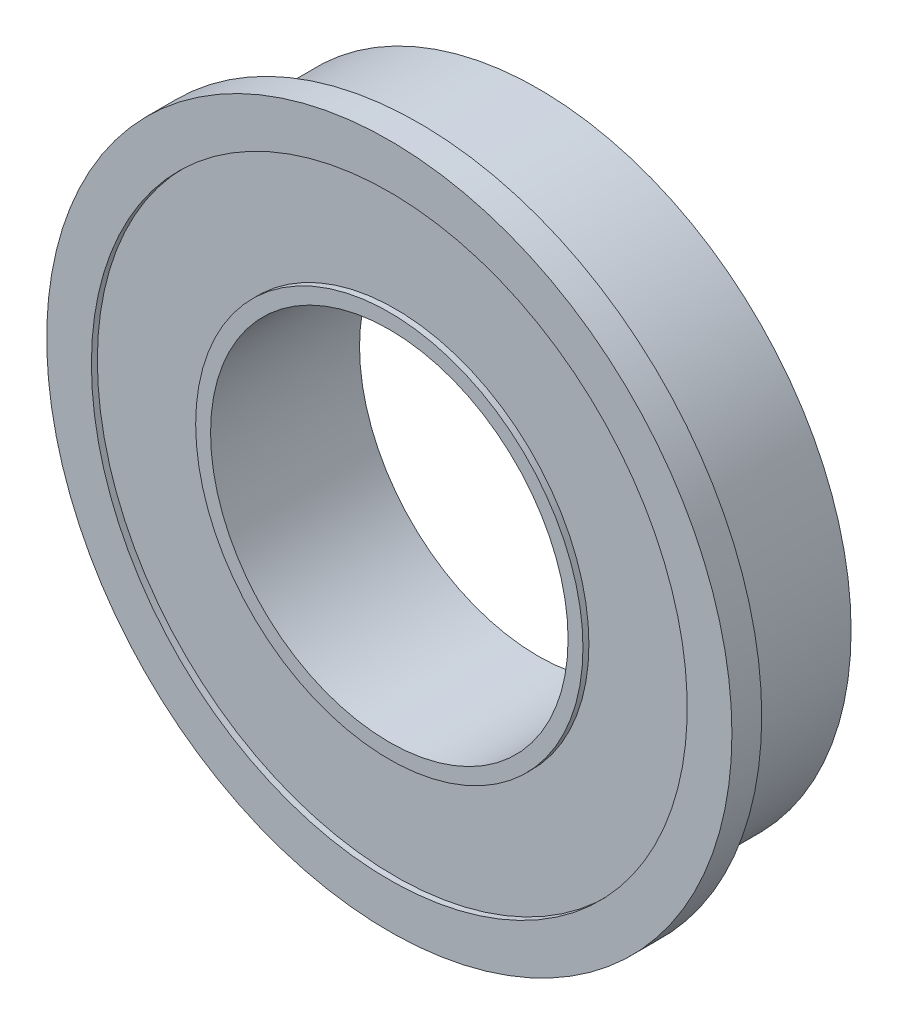
ISO-10303-21;
HEADER;
FILE_DESCRIPTION(('STEP AP214'),'2;1');
FILE_NAME('part.step','',(''),(''),'','','');
FILE_SCHEMA(('AUTOMOTIVE_DESIGN { 1 0 10303 214 1 1 1 1 }'));
ENDSEC;
DATA;
#1=APPLICATION_CONTEXT('core data for automotive mechanical design processes');
#2=APPLICATION_PROTOCOL_DEFINITION('international standard','automotive_design',2000,#1);
#3=PRODUCT_CONTEXT('',#1,'mechanical');
#4=PRODUCT('Part','Part','',(#3));
#5=PRODUCT_RELATED_PRODUCT_CATEGORY('part','',(#4));
#6=PRODUCT_DEFINITION_FORMATION('','',#4);
#7=PRODUCT_DEFINITION_CONTEXT('part definition',#1,'design');
#8=PRODUCT_DEFINITION('design','',#6,#7);
#9=PRODUCT_DEFINITION_SHAPE('','',#8);
#10=(LENGTH_UNIT() NAMED_UNIT(*) SI_UNIT(.MILLI.,.METRE.));
#11=(NAMED_UNIT(*) PLANE_ANGLE_UNIT() SI_UNIT($,.RADIAN.));
#12=(NAMED_UNIT(*) SI_UNIT($,.STERADIAN.) SOLID_ANGLE_UNIT());
#13=UNCERTAINTY_MEASURE_WITH_UNIT(LENGTH_MEASURE(1.E-05),#10,'distance_accuracy_value','');
#14=(GEOMETRIC_REPRESENTATION_CONTEXT(3) GLOBAL_UNCERTAINTY_ASSIGNED_CONTEXT((#13)) GLOBAL_UNIT_ASSIGNED_CONTEXT((#10,
#11,#12)) REPRESENTATION_CONTEXT('',''));
#15=CARTESIAN_POINT('',(0.,0.,0.));
#16=DIRECTION('',(0.,0.,1.));
#17=DIRECTION('',(1.,0.,0.));
#18=AXIS2_PLACEMENT_3D('',#15,#16,#17);
#19=CARTESIAN_POINT('',(0.,0.,1.));
#20=DIRECTION('',(0.,0.,1.));
#21=DIRECTION('',(1.,0.,0.));
#22=AXIS2_PLACEMENT_3D('',#19,#20,#21);
#23=PLANE('',#22);
#24=CARTESIAN_POINT('',(0.,0.,1.));
#25=DIRECTION('',(0.,0.,1.));
#26=DIRECTION('',(1.,0.,0.));
#27=AXIS2_PLACEMENT_3D('',#24,#25,#26);
#28=CIRCLE('',#27,6.);
#29=CARTESIAN_POINT('',(6.,0.,1.));
#30=VERTEX_POINT('',#29);
#31=EDGE_CURVE('E53',#30,#30,#28,.T.);
#32=ORIENTED_EDGE('',*,*,#31,.F.);
#33=EDGE_LOOP('',(#32));
#34=FACE_BOUND('',#33,.T.);
#35=CARTESIAN_POINT('',(0.,0.,1.));
#36=DIRECTION('',(0.,0.,-1.));
#37=DIRECTION('',(-1.,0.,0.));
#38=AXIS2_PLACEMENT_3D('',#35,#36,#37);
#39=CIRCLE('',#38,6.5);
#40=CARTESIAN_POINT('',(-6.5,0.,1.));
#41=VERTEX_POINT('',#40);
#42=EDGE_CURVE('E77',#41,#41,#39,.T.);
#43=ORIENTED_EDGE('',*,*,#42,.F.);
#44=EDGE_LOOP('',(#43));
#45=FACE_BOUND('',#44,.T.);
#46=ADVANCED_FACE('F34',(#34,#45),#23,.T.);
#47=CARTESIAN_POINT('',(0.,0.,-4.));
#48=DIRECTION('',(0.,0.,1.));
#49=DIRECTION('',(1.,0.,0.));
#50=AXIS2_PLACEMENT_3D('',#47,#48,#49);
#51=PLANE('',#50);
#52=CARTESIAN_POINT('',(0.,0.,-4.));
#53=DIRECTION('',(0.,0.,1.));
#54=DIRECTION('',(1.,0.,0.));
#55=AXIS2_PLACEMENT_3D('',#52,#53,#54);
#56=CIRCLE('',#55,6.);
#57=CARTESIAN_POINT('',(6.,0.,-4.));
#58=VERTEX_POINT('',#57);
#59=EDGE_CURVE('E52',#58,#58,#56,.T.);
#60=ORIENTED_EDGE('',*,*,#59,.T.);
#61=EDGE_LOOP('',(#60));
#62=FACE_BOUND('',#61,.T.);
#63=CARTESIAN_POINT('',(0.,0.,-4.));
#64=DIRECTION('',(0.,0.,-1.));
#65=DIRECTION('',(-1.,0.,0.));
#66=AXIS2_PLACEMENT_3D('',#63,#64,#65);
#67=CIRCLE('',#66,6.5);
#68=CARTESIAN_POINT('',(-6.5,0.,-4.));
#69=VERTEX_POINT('',#68);
#70=EDGE_CURVE('E65',#69,#69,#67,.T.);
#71=ORIENTED_EDGE('',*,*,#70,.T.);
#72=EDGE_LOOP('',(#71));
#73=FACE_BOUND('',#72,.T.);
#74=ADVANCED_FACE('F93',(#62,#73),#51,.F.);
#75=CARTESIAN_POINT('',(0.,0.,1.));
#76=DIRECTION('',(0.,0.,-1.));
#77=DIRECTION('',(-1.,0.,0.));
#78=AXIS2_PLACEMENT_3D('',#75,#76,#77);
#79=CIRCLE('',#78,10.);
#80=CARTESIAN_POINT('',(-10.,0.,1.));
#81=VERTEX_POINT('',#80);
#82=EDGE_CURVE('E71',#81,#81,#79,.T.);
#83=ORIENTED_EDGE('',*,*,#82,.T.);
#84=EDGE_LOOP('',(#83));
#85=FACE_BOUND('',#84,.T.);
#86=CARTESIAN_POINT('',(0.,0.,1.));
#87=DIRECTION('',(0.,0.,1.));
#88=DIRECTION('',(1.,0.,0.));
#89=AXIS2_PLACEMENT_3D('',#86,#87,#88);
#90=CIRCLE('',#89,11.5);
#91=CARTESIAN_POINT('',(11.5,0.,1.));
#92=VERTEX_POINT('',#91);
#93=EDGE_CURVE('E10',#92,#92,#90,.T.);
#94=ORIENTED_EDGE('',*,*,#93,.T.);
#95=EDGE_LOOP('',(#94));
#96=FACE_BOUND('',#95,.T.);
#97=ADVANCED_FACE('F96',(#85,#96),#23,.T.);
#98=CARTESIAN_POINT('',(0.,0.,0.));
#99=DIRECTION('',(0.,0.,1.));
#100=DIRECTION('',(1.,0.,0.));
#101=AXIS2_PLACEMENT_3D('',#98,#99,#100);
#102=PLANE('',#101);
#103=CARTESIAN_POINT('',(0.,0.,0.));
#104=DIRECTION('',(0.,0.,1.));
#105=DIRECTION('',(1.,0.,0.));
#106=AXIS2_PLACEMENT_3D('',#103,#104,#105);
#107=CIRCLE('',#106,11.5);
#108=CARTESIAN_POINT('',(11.5,0.,0.));
#109=VERTEX_POINT('',#108);
#110=EDGE_CURVE('E38',#109,#109,#107,.T.);
#111=ORIENTED_EDGE('',*,*,#110,.F.);
#112=EDGE_LOOP('',(#111));
#113=FACE_BOUND('',#112,.T.);
#114=CARTESIAN_POINT('',(0.,0.,0.));
#115=DIRECTION('',(0.,0.,1.));
#116=DIRECTION('',(1.,0.,0.));
#117=AXIS2_PLACEMENT_3D('',#114,#115,#116);
#118=CIRCLE('',#117,10.5);
#119=CARTESIAN_POINT('',(10.5,0.,0.));
#120=VERTEX_POINT('',#119);
#121=EDGE_CURVE('E45',#120,#120,#118,.T.);
#122=ORIENTED_EDGE('',*,*,#121,.T.);
#123=EDGE_LOOP('',(#122));
#124=FACE_BOUND('',#123,.T.);
#125=ADVANCED_FACE('F106',(#113,#124),#102,.F.);
#126=CARTESIAN_POINT('',(0.,0.,1.));
#127=DIRECTION('',(0.,0.,-1.));
#128=DIRECTION('',(-1.,0.,0.));
#129=AXIS2_PLACEMENT_3D('',#126,#127,#128);
#130=CYLINDRICAL_SURFACE('',#129,11.5);
#131=ORIENTED_EDGE('',*,*,#93,.F.);
#132=EDGE_LOOP('',(#131));
#133=FACE_BOUND('',#132,.T.);
#134=ORIENTED_EDGE('',*,*,#110,.T.);
#135=EDGE_LOOP('',(#134));
#136=FACE_BOUND('',#135,.T.);
#137=ADVANCED_FACE('F36',(#133,#136),#130,.T.);
#138=CARTESIAN_POINT('',(0.,0.,-4.));
#139=DIRECTION('',(0.,0.,1.));
#140=DIRECTION('',(1.,0.,0.));
#141=AXIS2_PLACEMENT_3D('',#138,#139,#140);
#142=CYLINDRICAL_SURFACE('',#141,10.5);
#143=CARTESIAN_POINT('',(0.,0.,-4.));
#144=DIRECTION('',(0.,0.,1.));
#145=DIRECTION('',(1.,0.,0.));
#146=AXIS2_PLACEMENT_3D('',#143,#144,#145);
#147=CIRCLE('',#146,10.5);
#148=CARTESIAN_POINT('',(10.5,0.,-4.));
#149=VERTEX_POINT('',#148);
#150=EDGE_CURVE('E49',#149,#149,#147,.T.);
#151=ORIENTED_EDGE('',*,*,#150,.T.);
#152=EDGE_LOOP('',(#151));
#153=FACE_BOUND('',#152,.T.);
#154=ORIENTED_EDGE('',*,*,#121,.F.);
#155=EDGE_LOOP('',(#154));
#156=FACE_BOUND('',#155,.T.);
#157=ADVANCED_FACE('F139',(#153,#156),#142,.T.);
#158=CARTESIAN_POINT('',(0.,0.,-4.));
#159=DIRECTION('',(0.,0.,-1.));
#160=DIRECTION('',(-1.,0.,0.));
#161=AXIS2_PLACEMENT_3D('',#158,#159,#160);
#162=CIRCLE('',#161,10.);
#163=CARTESIAN_POINT('',(-10.,0.,-4.));
#164=VERTEX_POINT('',#163);
#165=EDGE_CURVE('E59',#164,#164,#162,.T.);
#166=ORIENTED_EDGE('',*,*,#165,.F.);
#167=EDGE_LOOP('',(#166));
#168=FACE_BOUND('',#167,.T.);
#169=ORIENTED_EDGE('',*,*,#150,.F.);
#170=EDGE_LOOP('',(#169));
#171=FACE_BOUND('',#170,.T.);
#172=ADVANCED_FACE('F102',(#168,#171),#51,.F.);
#173=CARTESIAN_POINT('',(0.,0.,-4.));
#174=DIRECTION('',(0.,0.,1.));
#175=DIRECTION('',(1.,0.,0.));
#176=AXIS2_PLACEMENT_3D('',#173,#174,#175);
#177=CYLINDRICAL_SURFACE('',#176,6.);
#178=ORIENTED_EDGE('',*,*,#59,.F.);
#179=EDGE_LOOP('',(#178));
#180=FACE_BOUND('',#179,.T.);
#181=ORIENTED_EDGE('',*,*,#31,.T.);
#182=EDGE_LOOP('',(#181));
#183=FACE_BOUND('',#182,.T.);
#184=ADVANCED_FACE('F134',(#180,#183),#177,.F.);
#185=CARTESIAN_POINT('',(0.,0.,-3.8));
#186=DIRECTION('',(0.,0.,-1.));
#187=DIRECTION('',(-1.,0.,0.));
#188=AXIS2_PLACEMENT_3D('',#185,#186,#187);
#189=CYLINDRICAL_SURFACE('',#188,10.);
#190=CARTESIAN_POINT('',(0.,0.,-3.8));
#191=DIRECTION('',(0.,0.,-1.));
#192=DIRECTION('',(-1.,0.,0.));
#193=AXIS2_PLACEMENT_3D('',#190,#191,#192);
#194=CIRCLE('',#193,10.);
#195=CARTESIAN_POINT('',(-10.,0.,-3.8));
#196=VERTEX_POINT('',#195);
#197=EDGE_CURVE('E56',#196,#196,#194,.T.);
#198=ORIENTED_EDGE('',*,*,#197,.F.);
#199=EDGE_LOOP('',(#198));
#200=FACE_BOUND('',#199,.T.);
#201=ORIENTED_EDGE('',*,*,#165,.T.);
#202=EDGE_LOOP('',(#201));
#203=FACE_BOUND('',#202,.T.);
#204=ADVANCED_FACE('F130',(#200,#203),#189,.F.);
#205=CARTESIAN_POINT('',(0.,0.,-3.8));
#206=DIRECTION('',(0.,0.,-1.));
#207=DIRECTION('',(-1.,0.,0.));
#208=AXIS2_PLACEMENT_3D('',#205,#206,#207);
#209=PLANE('',#208);
#210=CARTESIAN_POINT('',(0.,0.,-3.8));
#211=DIRECTION('',(0.,0.,-1.));
#212=DIRECTION('',(-1.,0.,0.));
#213=AXIS2_PLACEMENT_3D('',#210,#211,#212);
#214=CIRCLE('',#213,6.5);
#215=CARTESIAN_POINT('',(-6.5,0.,-3.8));
#216=VERTEX_POINT('',#215);
#217=EDGE_CURVE('E62',#216,#216,#214,.T.);
#218=ORIENTED_EDGE('',*,*,#217,.F.);
#219=EDGE_LOOP('',(#218));
#220=FACE_BOUND('',#219,.T.);
#221=ORIENTED_EDGE('',*,*,#197,.T.);
#222=EDGE_LOOP('',(#221));
#223=FACE_BOUND('',#222,.T.);
#224=ADVANCED_FACE('F126',(#220,#223),#209,.T.);
#225=CARTESIAN_POINT('',(0.,0.,-3.8));
#226=DIRECTION('',(0.,0.,-1.));
#227=DIRECTION('',(-1.,0.,0.));
#228=AXIS2_PLACEMENT_3D('',#225,#226,#227);
#229=CYLINDRICAL_SURFACE('',#228,6.5);
#230=ORIENTED_EDGE('',*,*,#217,.T.);
#231=EDGE_LOOP('',(#230));
#232=FACE_BOUND('',#231,.T.);
#233=ORIENTED_EDGE('',*,*,#70,.F.);
#234=EDGE_LOOP('',(#233));
#235=FACE_BOUND('',#234,.T.);
#236=ADVANCED_FACE('F120',(#232,#235),#229,.T.);
#237=CARTESIAN_POINT('',(0.,0.,0.8));
#238=DIRECTION('',(0.,0.,1.));
#239=DIRECTION('',(-1.,0.,0.));
#240=AXIS2_PLACEMENT_3D('',#237,#238,#239);
#241=PLANE('',#240);
#242=CARTESIAN_POINT('',(0.,0.,0.8));
#243=DIRECTION('',(0.,0.,-1.));
#244=DIRECTION('',(-1.,0.,0.));
#245=AXIS2_PLACEMENT_3D('',#242,#243,#244);
#246=CIRCLE('',#245,10.);
#247=CARTESIAN_POINT('',(-10.,0.,0.8));
#248=VERTEX_POINT('',#247);
#249=EDGE_CURVE('E68',#248,#248,#246,.T.);
#250=ORIENTED_EDGE('',*,*,#249,.F.);
#251=EDGE_LOOP('',(#250));
#252=FACE_BOUND('',#251,.T.);
#253=CARTESIAN_POINT('',(0.,0.,0.8));
#254=DIRECTION('',(0.,0.,-1.));
#255=DIRECTION('',(-1.,0.,0.));
#256=AXIS2_PLACEMENT_3D('',#253,#254,#255);
#257=CIRCLE('',#256,6.5);
#258=CARTESIAN_POINT('',(-6.5,0.,0.8));
#259=VERTEX_POINT('',#258);
#260=EDGE_CURVE('E74',#259,#259,#257,.T.);
#261=ORIENTED_EDGE('',*,*,#260,.T.);
#262=EDGE_LOOP('',(#261));
#263=FACE_BOUND('',#262,.T.);
#264=ADVANCED_FACE('F83',(#252,#263),#241,.T.);
#265=CARTESIAN_POINT('',(0.,0.,0.8));
#266=DIRECTION('',(0.,0.,1.));
#267=DIRECTION('',(1.,0.,0.));
#268=AXIS2_PLACEMENT_3D('',#265,#266,#267);
#269=CYLINDRICAL_SURFACE('',#268,10.);
#270=ORIENTED_EDGE('',*,*,#249,.T.);
#271=EDGE_LOOP('',(#270));
#272=FACE_BOUND('',#271,.T.);
#273=ORIENTED_EDGE('',*,*,#82,.F.);
#274=EDGE_LOOP('',(#273));
#275=FACE_BOUND('',#274,.T.);
#276=ADVANCED_FACE('F88',(#272,#275),#269,.F.);
#277=CARTESIAN_POINT('',(0.,0.,0.8));
#278=DIRECTION('',(0.,0.,1.));
#279=DIRECTION('',(1.,0.,0.));
#280=AXIS2_PLACEMENT_3D('',#277,#278,#279);
#281=CYLINDRICAL_SURFACE('',#280,6.5);
#282=ORIENTED_EDGE('',*,*,#260,.F.);
#283=EDGE_LOOP('',(#282));
#284=FACE_BOUND('',#283,.T.);
#285=ORIENTED_EDGE('',*,*,#42,.T.);
#286=EDGE_LOOP('',(#285));
#287=FACE_BOUND('',#286,.T.);
#288=ADVANCED_FACE('F85',(#284,#287),#281,.T.);
#289=CLOSED_SHELL('',(#46,#74,#97,#125,#137,#157,#172,#184,#204,#224,#236,#264,#276,#288));
#290=MANIFOLD_SOLID_BREP('B2',#289);
#291=ADVANCED_BREP_SHAPE_REPRESENTATION('',(#18,#290),#14);
#292=SHAPE_DEFINITION_REPRESENTATION(#9,#291);
ENDSEC;
END-ISO-10303-21;
